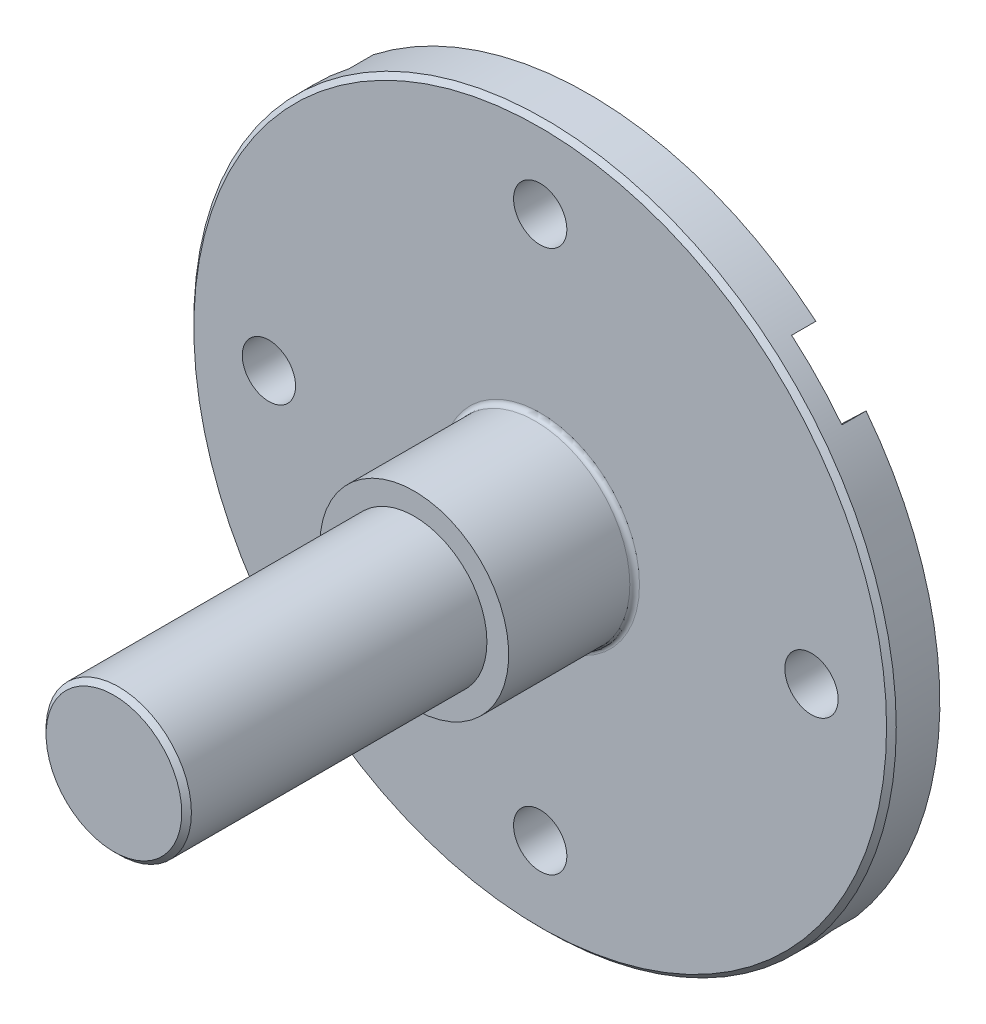
ISO-10303-21;
HEADER;
FILE_DESCRIPTION(('STEP AP214'),'2;1');
FILE_NAME('part.step','',(''),(''),'','','');
FILE_SCHEMA(('AUTOMOTIVE_DESIGN { 1 0 10303 214 1 1 1 1 }'));
ENDSEC;
DATA;
#1=APPLICATION_CONTEXT('core data for automotive mechanical design processes');
#2=APPLICATION_PROTOCOL_DEFINITION('international standard','automotive_design',2000,#1);
#3=PRODUCT_CONTEXT('',#1,'mechanical');
#4=PRODUCT('Part','Part','',(#3));
#5=PRODUCT_RELATED_PRODUCT_CATEGORY('part','',(#4));
#6=PRODUCT_DEFINITION_FORMATION('','',#4);
#7=PRODUCT_DEFINITION_CONTEXT('part definition',#1,'design');
#8=PRODUCT_DEFINITION('design','',#6,#7);
#9=PRODUCT_DEFINITION_SHAPE('','',#8);
#10=(LENGTH_UNIT() NAMED_UNIT(*) SI_UNIT(.MILLI.,.METRE.));
#11=(NAMED_UNIT(*) PLANE_ANGLE_UNIT() SI_UNIT($,.RADIAN.));
#12=(NAMED_UNIT(*) SI_UNIT($,.STERADIAN.) SOLID_ANGLE_UNIT());
#13=UNCERTAINTY_MEASURE_WITH_UNIT(LENGTH_MEASURE(1.E-05),#10,'distance_accuracy_value','');
#14=(GEOMETRIC_REPRESENTATION_CONTEXT(3) GLOBAL_UNCERTAINTY_ASSIGNED_CONTEXT((#13)) GLOBAL_UNIT_ASSIGNED_CONTEXT((#10,
#11,#12)) REPRESENTATION_CONTEXT('',''));
#15=CARTESIAN_POINT('',(0.,0.,0.));
#16=DIRECTION('',(0.,0.,1.));
#17=DIRECTION('',(1.,0.,0.));
#18=AXIS2_PLACEMENT_3D('',#15,#16,#17);
#19=CARTESIAN_POINT('',(0.,0.,10.));
#20=DIRECTION('',(0.,0.,1.));
#21=DIRECTION('',(1.,0.,0.));
#22=AXIS2_PLACEMENT_3D('',#19,#20,#21);
#23=PLANE('',#22);
#24=CARTESIAN_POINT('',(-0.00132234551098939,55.9999999843875,9.99999999999998));
#25=DIRECTION('',(0.,0.,1.));
#26=DIRECTION('',(1.,0.,0.));
#27=AXIS2_PLACEMENT_3D('',#24,#25,#26);
#28=CIRCLE('',#27,5.49999999999999);
#29=CARTESIAN_POINT('',(5.498677654489,55.9999999843875,9.99999999999998));
#30=VERTEX_POINT('',#29);
#31=EDGE_CURVE('E426',#30,#30,#28,.T.);
#32=ORIENTED_EDGE('',*,*,#31,.F.);
#33=EDGE_LOOP('',(#32));
#34=FACE_BOUND('',#33,.T.);
#35=CARTESIAN_POINT('',(-0.000731886751224875,-56.0000000140561,9.99999999999998));
#36=DIRECTION('',(0.,0.,1.));
#37=DIRECTION('',(1.,0.,0.));
#38=AXIS2_PLACEMENT_3D('',#35,#36,#37);
#39=CIRCLE('',#38,5.49999999999999);
#40=CARTESIAN_POINT('',(5.49926811324876,-56.0000000140561,9.99999999999998));
#41=VERTEX_POINT('',#40);
#42=EDGE_CURVE('E428',#41,#41,#39,.T.);
#43=ORIENTED_EDGE('',*,*,#42,.F.);
#44=EDGE_LOOP('',(#43));
#45=FACE_BOUND('',#44,.T.);
#46=CARTESIAN_POINT('',(-56.0010271153529,-0.000295244214201795,9.99999999999998));
#47=DIRECTION('',(0.,0.,1.));
#48=DIRECTION('',(1.,0.,0.));
#49=AXIS2_PLACEMENT_3D('',#46,#47,#48);
#50=CIRCLE('',#49,5.49999999999999);
#51=CARTESIAN_POINT('',(-50.5010271153529,-0.000295244214201795,9.99999999999998));
#52=VERTEX_POINT('',#51);
#53=EDGE_CURVE('E436',#52,#52,#50,.T.);
#54=ORIENTED_EDGE('',*,*,#53,.F.);
#55=EDGE_LOOP('',(#54));
#56=FACE_BOUND('',#55,.T.);
#57=CARTESIAN_POINT('',(55.9989728830907,0.000295214545569661,9.99999999999998));
#58=DIRECTION('',(0.,0.,1.));
#59=DIRECTION('',(1.,0.,0.));
#60=AXIS2_PLACEMENT_3D('',#57,#58,#59);
#61=CIRCLE('',#60,5.49999999999999);
#62=CARTESIAN_POINT('',(61.4989728830907,0.000295214545569661,9.99999999999998));
#63=VERTEX_POINT('',#62);
#64=EDGE_CURVE('E442',#63,#63,#61,.T.);
#65=ORIENTED_EDGE('',*,*,#64,.F.);
#66=EDGE_LOOP('',(#65));
#67=FACE_BOUND('',#66,.T.);
#68=CARTESIAN_POINT('',(0.,0.,10.));
#69=DIRECTION('',(0.,0.,1.));
#70=DIRECTION('',(1.,0.,0.));
#71=AXIS2_PLACEMENT_3D('',#68,#69,#70);
#72=CIRCLE('',#71,20.5);
#73=CARTESIAN_POINT('',(20.5,0.,10.));
#74=VERTEX_POINT('',#73);
#75=EDGE_CURVE('E285',#74,#74,#72,.F.);
#76=ORIENTED_EDGE('',*,*,#75,.T.);
#77=EDGE_LOOP('',(#76));
#78=FACE_BOUND('',#77,.T.);
#79=CARTESIAN_POINT('',(0.,0.,10.));
#80=DIRECTION('',(0.,0.,1.));
#81=DIRECTION('',(1.,0.,0.));
#82=AXIS2_PLACEMENT_3D('',#79,#80,#81);
#83=CIRCLE('',#82,71.5);
#84=CARTESIAN_POINT('',(71.5,0.,10.));
#85=VERTEX_POINT('',#84);
#86=EDGE_CURVE('E276',#85,#85,#83,.T.);
#87=ORIENTED_EDGE('',*,*,#86,.T.);
#88=EDGE_LOOP('',(#87));
#89=FACE_BOUND('',#88,.T.);
#90=ADVANCED_FACE('F37',(#34,#45,#56,#67,#78,#89),#23,.T.);
#91=CARTESIAN_POINT('',(0.,0.,10.));
#92=DIRECTION('',(0.,0.,-1.));
#93=DIRECTION('',(-1.,0.,0.));
#94=AXIS2_PLACEMENT_3D('',#91,#92,#93);
#95=CYLINDRICAL_SURFACE('',#94,72.5);
#96=CARTESIAN_POINT('',(0.,0.,9.00000000000003));
#97=DIRECTION('',(0.,0.,1.));
#98=DIRECTION('',(1.,0.,0.));
#99=AXIS2_PLACEMENT_3D('',#96,#97,#98);
#100=CIRCLE('',#99,72.5);
#101=CARTESIAN_POINT('',(72.5,0.,9.00000000000003));
#102=VERTEX_POINT('',#101);
#103=EDGE_CURVE('E279',#102,#102,#100,.F.);
#104=ORIENTED_EDGE('',*,*,#103,.T.);
#105=EDGE_LOOP('',(#104));
#106=FACE_BOUND('',#105,.T.);
#107=CARTESIAN_POINT('',(0.,0.,5.));
#108=DIRECTION('',(0.,0.,-1.));
#109=DIRECTION('',(0.,-1.,0.));
#110=AXIS2_PLACEMENT_3D('',#107,#108,#109);
#111=CIRCLE('',#110,72.5);
#112=CARTESIAN_POINT('',(-55.2891889648152,46.8972875933455,5.));
#113=VERTEX_POINT('',#112);
#114=CARTESIAN_POINT('',(-44.4549998969545,57.2713103059618,5.));
#115=VERTEX_POINT('',#114);
#116=EDGE_CURVE('E159',#113,#115,#111,.T.);
#117=ORIENTED_EDGE('',*,*,#116,.F.);
#118=DIRECTION('',(0.,0.,-1.));
#119=VECTOR('',#118,1.);
#120=CARTESIAN_POINT('',(-55.2891889648152,46.8972875933455,5.));
#121=LINE('',#120,#119);
#122=CARTESIAN_POINT('',(-55.2891889648152,46.8972875933455,0.));
#123=VERTEX_POINT('',#122);
#124=EDGE_CURVE('E197',#113,#123,#121,.T.);
#125=ORIENTED_EDGE('',*,*,#124,.T.);
#126=CARTESIAN_POINT('',(0.,0.,0.));
#127=DIRECTION('',(0.,0.,1.));
#128=DIRECTION('',(1.,0.,0.));
#129=AXIS2_PLACEMENT_3D('',#126,#127,#128);
#130=CIRCLE('',#129,72.5);
#131=CARTESIAN_POINT('',(-57.2713103059617,-44.4549998969547,0.));
#132=VERTEX_POINT('',#131);
#133=EDGE_CURVE('E60',#123,#132,#130,.T.);
#134=ORIENTED_EDGE('',*,*,#133,.T.);
#135=DIRECTION('',(0.,0.,-1.));
#136=VECTOR('',#135,1.);
#137=CARTESIAN_POINT('',(-57.2713103059617,-44.4549998969547,5.));
#138=LINE('',#137,#136);
#139=CARTESIAN_POINT('',(-57.2713103059617,-44.4549998969547,5.));
#140=VERTEX_POINT('',#139);
#141=EDGE_CURVE('E192',#140,#132,#138,.T.);
#142=ORIENTED_EDGE('',*,*,#141,.F.);
#143=CARTESIAN_POINT('',(0.,0.,5.));
#144=DIRECTION('',(0.,0.,-1.));
#145=DIRECTION('',(1.,0.,0.));
#146=AXIS2_PLACEMENT_3D('',#143,#144,#145);
#147=CIRCLE('',#146,72.5);
#148=CARTESIAN_POINT('',(-46.8972875933453,-55.2891889648154,5.));
#149=VERTEX_POINT('',#148);
#150=EDGE_CURVE('E179',#149,#140,#147,.T.);
#151=ORIENTED_EDGE('',*,*,#150,.F.);
#152=DIRECTION('',(0.,0.,-1.));
#153=VECTOR('',#152,1.);
#154=CARTESIAN_POINT('',(-46.8972875933453,-55.2891889648154,5.));
#155=LINE('',#154,#153);
#156=CARTESIAN_POINT('',(-46.8972875933453,-55.2891889648154,0.));
#157=VERTEX_POINT('',#156);
#158=EDGE_CURVE('E201',#149,#157,#155,.T.);
#159=ORIENTED_EDGE('',*,*,#158,.T.);
#160=CARTESIAN_POINT('',(44.4549998969549,-57.2713103059615,0.));
#161=VERTEX_POINT('',#160);
#162=EDGE_CURVE('E460',#157,#161,#130,.T.);
#163=ORIENTED_EDGE('',*,*,#162,.T.);
#164=DIRECTION('',(0.,0.,-1.));
#165=VECTOR('',#164,1.);
#166=CARTESIAN_POINT('',(44.4549998969549,-57.2713103059615,5.));
#167=LINE('',#166,#165);
#168=CARTESIAN_POINT('',(44.4549998969549,-57.2713103059615,5.));
#169=VERTEX_POINT('',#168);
#170=EDGE_CURVE('E223',#169,#161,#167,.T.);
#171=ORIENTED_EDGE('',*,*,#170,.F.);
#172=CARTESIAN_POINT('',(0.,0.,5.));
#173=DIRECTION('',(0.,0.,-1.));
#174=DIRECTION('',(0.,1.,0.));
#175=AXIS2_PLACEMENT_3D('',#172,#173,#174);
#176=CIRCLE('',#175,72.5);
#177=CARTESIAN_POINT('',(55.2891889648155,-46.8972875933451,5.));
#178=VERTEX_POINT('',#177);
#179=EDGE_CURVE('E210',#178,#169,#176,.T.);
#180=ORIENTED_EDGE('',*,*,#179,.F.);
#181=DIRECTION('',(0.,0.,-1.));
#182=VECTOR('',#181,1.);
#183=CARTESIAN_POINT('',(55.2891889648155,-46.8972875933451,5.));
#184=LINE('',#183,#182);
#185=CARTESIAN_POINT('',(55.2891889648155,-46.8972875933451,0.));
#186=VERTEX_POINT('',#185);
#187=EDGE_CURVE('E230',#178,#186,#184,.T.);
#188=ORIENTED_EDGE('',*,*,#187,.T.);
#189=CARTESIAN_POINT('',(57.2713103059614,44.4549998969551,0.));
#190=VERTEX_POINT('',#189);
#191=EDGE_CURVE('E271',#186,#190,#130,.T.);
#192=ORIENTED_EDGE('',*,*,#191,.T.);
#193=DIRECTION('',(0.,0.,-1.));
#194=VECTOR('',#193,1.);
#195=CARTESIAN_POINT('',(57.2713103059614,44.4549998969551,5.));
#196=LINE('',#195,#194);
#197=CARTESIAN_POINT('',(57.2713103059614,44.4549998969551,5.));
#198=VERTEX_POINT('',#197);
#199=EDGE_CURVE('E253',#198,#190,#196,.T.);
#200=ORIENTED_EDGE('',*,*,#199,.F.);
#201=CARTESIAN_POINT('',(0.,0.,5.));
#202=DIRECTION('',(0.,0.,-1.));
#203=DIRECTION('',(-1.,0.,0.));
#204=AXIS2_PLACEMENT_3D('',#201,#202,#203);
#205=CIRCLE('',#204,72.5);
#206=CARTESIAN_POINT('',(46.8972875933449,55.2891889648157,5.));
#207=VERTEX_POINT('',#206);
#208=EDGE_CURVE('E240',#207,#198,#205,.T.);
#209=ORIENTED_EDGE('',*,*,#208,.F.);
#210=DIRECTION('',(0.,0.,-1.));
#211=VECTOR('',#210,1.);
#212=CARTESIAN_POINT('',(46.8972875933449,55.2891889648157,5.));
#213=LINE('',#212,#211);
#214=CARTESIAN_POINT('',(46.8972875933449,55.2891889648157,0.));
#215=VERTEX_POINT('',#214);
#216=EDGE_CURVE('E260',#207,#215,#213,.T.);
#217=ORIENTED_EDGE('',*,*,#216,.T.);
#218=CARTESIAN_POINT('',(-44.4549998969545,57.2713103059619,0.));
#219=VERTEX_POINT('',#218);
#220=EDGE_CURVE('E172',#215,#219,#130,.T.);
#221=ORIENTED_EDGE('',*,*,#220,.T.);
#222=DIRECTION('',(0.,0.,-1.));
#223=VECTOR('',#222,1.);
#224=CARTESIAN_POINT('',(-44.4549998969545,57.2713103059618,5.));
#225=LINE('',#224,#223);
#226=EDGE_CURVE('E52',#115,#219,#225,.T.);
#227=ORIENTED_EDGE('',*,*,#226,.F.);
#228=EDGE_LOOP('',(#117,#125,#134,#142,#151,#159,#163,#171,#180,#188,#192,#200,#209,#217,#221,#227));
#229=FACE_BOUND('',#228,.T.);
#230=ADVANCED_FACE('F169',(#106,#229),#95,.T.);
#231=CARTESIAN_POINT('',(0.,0.,0.));
#232=DIRECTION('',(0.,0.,1.));
#233=DIRECTION('',(1.,0.,0.));
#234=AXIS2_PLACEMENT_3D('',#231,#232,#233);
#235=PLANE('',#234);
#236=CARTESIAN_POINT('',(-0.00132234551098939,55.9999999843875,0.));
#237=DIRECTION('',(0.,0.,1.));
#238=DIRECTION('',(1.,0.,0.));
#239=AXIS2_PLACEMENT_3D('',#236,#237,#238);
#240=CIRCLE('',#239,5.49999999999999);
#241=CARTESIAN_POINT('',(5.498677654489,55.9999999843875,0.));
#242=VERTEX_POINT('',#241);
#243=EDGE_CURVE('E424',#242,#242,#240,.T.);
#244=ORIENTED_EDGE('',*,*,#243,.T.);
#245=EDGE_LOOP('',(#244));
#246=FACE_BOUND('',#245,.T.);
#247=CARTESIAN_POINT('',(-0.000731886751224875,-56.0000000140561,0.));
#248=DIRECTION('',(0.,0.,1.));
#249=DIRECTION('',(1.,0.,0.));
#250=AXIS2_PLACEMENT_3D('',#247,#248,#249);
#251=CIRCLE('',#250,5.49999999999999);
#252=CARTESIAN_POINT('',(5.49926811324876,-56.0000000140561,0.));
#253=VERTEX_POINT('',#252);
#254=EDGE_CURVE('E433',#253,#253,#251,.T.);
#255=ORIENTED_EDGE('',*,*,#254,.T.);
#256=EDGE_LOOP('',(#255));
#257=FACE_BOUND('',#256,.T.);
#258=CARTESIAN_POINT('',(-56.0010271153529,-0.000295244214201795,0.));
#259=DIRECTION('',(0.,0.,1.));
#260=DIRECTION('',(1.,0.,0.));
#261=AXIS2_PLACEMENT_3D('',#258,#259,#260);
#262=CIRCLE('',#261,5.49999999999998);
#263=CARTESIAN_POINT('',(-50.5010271153529,-0.000295244214201795,0.));
#264=VERTEX_POINT('',#263);
#265=EDGE_CURVE('E439',#264,#264,#262,.T.);
#266=ORIENTED_EDGE('',*,*,#265,.T.);
#267=EDGE_LOOP('',(#266));
#268=FACE_BOUND('',#267,.T.);
#269=CARTESIAN_POINT('',(55.9989728830907,0.000295214545569661,0.));
#270=DIRECTION('',(0.,0.,1.));
#271=DIRECTION('',(1.,0.,0.));
#272=AXIS2_PLACEMENT_3D('',#269,#270,#271);
#273=CIRCLE('',#272,5.49999999999998);
#274=CARTESIAN_POINT('',(61.4989728830907,0.000295214545569661,0.));
#275=VERTEX_POINT('',#274);
#276=EDGE_CURVE('E445',#275,#275,#273,.T.);
#277=ORIENTED_EDGE('',*,*,#276,.T.);
#278=EDGE_LOOP('',(#277));
#279=FACE_BOUND('',#278,.T.);
#280=ORIENTED_EDGE('',*,*,#133,.F.);
#281=DIRECTION('',(-0.691601514174375,0.72227927119066,0.));
#282=VECTOR('',#281,1.);
#283=CARTESIAN_POINT('',(-22.7071323882898,12.8699704234584,0.));
#284=LINE('',#283,#282);
#285=CARTESIAN_POINT('',(-22.7071323882898,12.8699704234584,0.));
#286=VERTEX_POINT('',#285);
#287=EDGE_CURVE('E166',#286,#123,#284,.T.);
#288=ORIENTED_EDGE('',*,*,#287,.F.);
#289=CARTESIAN_POINT('',(-17.2900378543595,18.0569817797666,0.));
#290=DIRECTION('',(0.,0.,-1.));
#291=DIRECTION('',(0.,-1.,0.));
#292=AXIS2_PLACEMENT_3D('',#289,#290,#291);
#293=CIRCLE('',#292,7.50000000000053);
#294=CARTESIAN_POINT('',(-11.8729433204292,23.2439931360748,0.));
#295=VERTEX_POINT('',#294);
#296=EDGE_CURVE('E451',#295,#286,#293,.T.);
#297=ORIENTED_EDGE('',*,*,#296,.F.);
#298=DIRECTION('',(0.691601514174376,-0.72227927119066,0.));
#299=VECTOR('',#298,1.);
#300=CARTESIAN_POINT('',(-44.4549998969545,57.2713103059618,0.));
#301=LINE('',#300,#299);
#302=EDGE_CURVE('E447',#219,#295,#301,.T.);
#303=ORIENTED_EDGE('',*,*,#302,.F.);
#304=ORIENTED_EDGE('',*,*,#220,.F.);
#305=DIRECTION('',(0.722279271190653,0.691601514174383,0.));
#306=VECTOR('',#305,1.);
#307=CARTESIAN_POINT('',(12.8699704234582,22.70713238829,0.));
#308=LINE('',#307,#306);
#309=CARTESIAN_POINT('',(12.8699704234582,22.7071323882899,0.));
#310=VERTEX_POINT('',#309);
#311=EDGE_CURVE('E244',#310,#215,#308,.T.);
#312=ORIENTED_EDGE('',*,*,#311,.F.);
#313=CARTESIAN_POINT('',(18.0569817797664,17.2900378543597,0.));
#314=DIRECTION('',(0.,0.,-1.));
#315=DIRECTION('',(-1.,0.,0.));
#316=AXIS2_PLACEMENT_3D('',#313,#314,#315);
#317=CIRCLE('',#316,7.50000000000053);
#318=CARTESIAN_POINT('',(23.2439931360747,11.8729433204294,0.));
#319=VERTEX_POINT('',#318);
#320=EDGE_CURVE('E256',#319,#310,#317,.T.);
#321=ORIENTED_EDGE('',*,*,#320,.F.);
#322=DIRECTION('',(-0.722279271190653,-0.691601514174383,0.));
#323=VECTOR('',#322,1.);
#324=CARTESIAN_POINT('',(57.2713103059614,44.4549998969551,0.));
#325=LINE('',#324,#323);
#326=EDGE_CURVE('E233',#190,#319,#325,.T.);
#327=ORIENTED_EDGE('',*,*,#326,.F.);
#328=ORIENTED_EDGE('',*,*,#191,.F.);
#329=DIRECTION('',(0.69160151417438,-0.722279271190655,0.));
#330=VECTOR('',#329,1.);
#331=CARTESIAN_POINT('',(22.7071323882899,-12.8699704234583,0.));
#332=LINE('',#331,#330);
#333=CARTESIAN_POINT('',(22.7071323882899,-12.8699704234583,0.));
#334=VERTEX_POINT('',#333);
#335=EDGE_CURVE('E214',#334,#186,#332,.T.);
#336=ORIENTED_EDGE('',*,*,#335,.F.);
#337=CARTESIAN_POINT('',(17.2900378543596,-18.0569817797665,0.));
#338=DIRECTION('',(0.,0.,-1.));
#339=DIRECTION('',(0.,1.,0.));
#340=AXIS2_PLACEMENT_3D('',#337,#338,#339);
#341=CIRCLE('',#340,7.50000000000053);
#342=CARTESIAN_POINT('',(11.8729433204293,-23.2439931360747,0.));
#343=VERTEX_POINT('',#342);
#344=EDGE_CURVE('E226',#343,#334,#341,.T.);
#345=ORIENTED_EDGE('',*,*,#344,.F.);
#346=DIRECTION('',(-0.691601514174381,0.722279271190655,0.));
#347=VECTOR('',#346,1.);
#348=CARTESIAN_POINT('',(44.4549998969549,-57.2713103059615,0.));
#349=LINE('',#348,#347);
#350=EDGE_CURVE('E204',#161,#343,#349,.T.);
#351=ORIENTED_EDGE('',*,*,#350,.F.);
#352=ORIENTED_EDGE('',*,*,#162,.F.);
#353=DIRECTION('',(-0.722279271190658,-0.691601514174378,0.));
#354=VECTOR('',#353,1.);
#355=CARTESIAN_POINT('',(-12.8699704234584,-22.7071323882899,0.));
#356=LINE('',#355,#354);
#357=CARTESIAN_POINT('',(-12.8699704234584,-22.7071323882899,0.));
#358=VERTEX_POINT('',#357);
#359=EDGE_CURVE('E183',#358,#157,#356,.T.);
#360=ORIENTED_EDGE('',*,*,#359,.F.);
#361=CARTESIAN_POINT('',(-18.0569817797666,-17.2900378543595,0.));
#362=DIRECTION('',(0.,0.,-1.));
#363=DIRECTION('',(1.,0.,0.));
#364=AXIS2_PLACEMENT_3D('',#361,#362,#363);
#365=CIRCLE('',#364,7.50000000000053);
#366=CARTESIAN_POINT('',(-23.2439931360748,-11.8729433204292,0.));
#367=VERTEX_POINT('',#366);
#368=EDGE_CURVE('E196',#367,#358,#365,.T.);
#369=ORIENTED_EDGE('',*,*,#368,.F.);
#370=DIRECTION('',(0.722279271190657,0.691601514174378,0.));
#371=VECTOR('',#370,1.);
#372=CARTESIAN_POINT('',(-57.2713103059617,-44.4549998969547,0.));
#373=LINE('',#372,#371);
#374=EDGE_CURVE('E193',#132,#367,#373,.T.);
#375=ORIENTED_EDGE('',*,*,#374,.F.);
#376=EDGE_LOOP('',(#280,#288,#297,#303,#304,#312,#321,#327,#328,#336,#345,#351,#352,#360,#369,#375));
#377=FACE_BOUND('',#376,.T.);
#378=ADVANCED_FACE('F310',(#246,#257,#268,#279,#377),#235,.F.);
#379=CARTESIAN_POINT('',(0.,0.,36.));
#380=DIRECTION('',(0.,0.,-1.));
#381=DIRECTION('',(-1.,0.,0.));
#382=AXIS2_PLACEMENT_3D('',#379,#380,#381);
#383=CYLINDRICAL_SURFACE('',#382,19.5);
#384=CARTESIAN_POINT('',(0.,0.,11.));
#385=DIRECTION('',(0.,0.,1.));
#386=DIRECTION('',(1.,0.,0.));
#387=AXIS2_PLACEMENT_3D('',#384,#385,#386);
#388=CIRCLE('',#387,19.5);
#389=CARTESIAN_POINT('',(-19.5,0.,11.));
#390=VERTEX_POINT('',#389);
#391=EDGE_CURVE('E282',#390,#390,#388,.T.);
#392=CARTESIAN_POINT('',(0.,0.,36.));
#393=DIRECTION('',(0.,0.,1.));
#394=DIRECTION('',(1.,0.,0.));
#395=AXIS2_PLACEMENT_3D('',#392,#393,#394);
#396=CIRCLE('',#395,19.5);
#397=CARTESIAN_POINT('',(-19.5,0.,36.));
#398=VERTEX_POINT('',#397);
#399=EDGE_CURVE('E262',#398,#398,#396,.T.);
#400=CARTESIAN_POINT('',(-19.5,0.,11.));
#401=CARTESIAN_POINT('',(-19.5,0.,11.2604166666667));
#402=CARTESIAN_POINT('',(-19.5,0.,11.5208333333333));
#403=CARTESIAN_POINT('',(-19.5,0.,12.0416666666667));
#404=CARTESIAN_POINT('',(-19.5,0.,12.3020833333333));
#405=CARTESIAN_POINT('',(-19.5,0.,12.8229166666667));
#406=CARTESIAN_POINT('',(-19.5,0.,13.0833333333333));
#407=CARTESIAN_POINT('',(-19.5,0.,13.6041666666667));
#408=CARTESIAN_POINT('',(-19.5,0.,13.8645833333333));
#409=CARTESIAN_POINT('',(-19.5,0.,14.3854166666667));
#410=CARTESIAN_POINT('',(-19.5,0.,14.6458333333333));
#411=CARTESIAN_POINT('',(-19.5,0.,15.1666666666667));
#412=CARTESIAN_POINT('',(-19.5,0.,15.4270833333333));
#413=CARTESIAN_POINT('',(-19.5,0.,15.9479166666667));
#414=CARTESIAN_POINT('',(-19.5,0.,16.2083333333333));
#415=CARTESIAN_POINT('',(-19.5,0.,16.7291666666667));
#416=CARTESIAN_POINT('',(-19.5,0.,16.9895833333333));
#417=CARTESIAN_POINT('',(-19.5,0.,17.5104166666667));
#418=CARTESIAN_POINT('',(-19.5,0.,17.7708333333333));
#419=CARTESIAN_POINT('',(-19.5,0.,18.2916666666667));
#420=CARTESIAN_POINT('',(-19.5,0.,18.5520833333333));
#421=CARTESIAN_POINT('',(-19.5,0.,19.0729166666667));
#422=CARTESIAN_POINT('',(-19.5,0.,19.3333333333333));
#423=CARTESIAN_POINT('',(-19.5,0.,19.8541666666667));
#424=CARTESIAN_POINT('',(-19.5,0.,20.1145833333333));
#425=CARTESIAN_POINT('',(-19.5,0.,20.6354166666667));
#426=CARTESIAN_POINT('',(-19.5,0.,20.8958333333333));
#427=CARTESIAN_POINT('',(-19.5,0.,21.4166666666667));
#428=CARTESIAN_POINT('',(-19.5,0.,21.6770833333333));
#429=CARTESIAN_POINT('',(-19.5,0.,22.1979166666667));
#430=CARTESIAN_POINT('',(-19.5,0.,22.4583333333333));
#431=CARTESIAN_POINT('',(-19.5,0.,22.9791666666667));
#432=CARTESIAN_POINT('',(-19.5,0.,23.2395833333333));
#433=CARTESIAN_POINT('',(-19.5,0.,23.7604166666667));
#434=CARTESIAN_POINT('',(-19.5,0.,24.0208333333333));
#435=CARTESIAN_POINT('',(-19.5,0.,24.5416666666667));
#436=CARTESIAN_POINT('',(-19.5,0.,24.8020833333333));
#437=CARTESIAN_POINT('',(-19.5,0.,25.3229166666667));
#438=CARTESIAN_POINT('',(-19.5,0.,25.5833333333333));
#439=CARTESIAN_POINT('',(-19.5,0.,26.1041666666667));
#440=CARTESIAN_POINT('',(-19.5,0.,26.3645833333333));
#441=CARTESIAN_POINT('',(-19.5,0.,26.8854166666667));
#442=CARTESIAN_POINT('',(-19.5,0.,27.1458333333333));
#443=CARTESIAN_POINT('',(-19.5,0.,27.6666666666667));
#444=CARTESIAN_POINT('',(-19.5,0.,27.9270833333333));
#445=CARTESIAN_POINT('',(-19.5,0.,28.4479166666667));
#446=CARTESIAN_POINT('',(-19.5,0.,28.7083333333333));
#447=CARTESIAN_POINT('',(-19.5,0.,29.2291666666667));
#448=CARTESIAN_POINT('',(-19.5,0.,29.4895833333333));
#449=CARTESIAN_POINT('',(-19.5,0.,30.0104166666667));
#450=CARTESIAN_POINT('',(-19.5,0.,30.2708333333333));
#451=CARTESIAN_POINT('',(-19.5,0.,30.7916666666667));
#452=CARTESIAN_POINT('',(-19.5,0.,31.0520833333333));
#453=CARTESIAN_POINT('',(-19.5,0.,31.5729166666667));
#454=CARTESIAN_POINT('',(-19.5,0.,31.8333333333333));
#455=CARTESIAN_POINT('',(-19.5,0.,32.3541666666667));
#456=CARTESIAN_POINT('',(-19.5,0.,32.6145833333333));
#457=CARTESIAN_POINT('',(-19.5,0.,33.1354166666667));
#458=CARTESIAN_POINT('',(-19.5,0.,33.3958333333333));
#459=CARTESIAN_POINT('',(-19.5,0.,33.9166666666667));
#460=CARTESIAN_POINT('',(-19.5,0.,34.1770833333333));
#461=CARTESIAN_POINT('',(-19.5,0.,34.6979166666667));
#462=CARTESIAN_POINT('',(-19.5,0.,34.9583333333333));
#463=CARTESIAN_POINT('',(-19.5,0.,35.4791666666667));
#464=CARTESIAN_POINT('',(-19.5,0.,35.7395833333333));
#465=CARTESIAN_POINT('',(-19.5,0.,36.));
#466=B_SPLINE_CURVE_WITH_KNOTS('',3,(#400,#401,#402,#403,#404,#405,#406,#407,#408,#409,#410,
#411,#412,#413,#414,#415,#416,#417,#418,#419,#420,#421,#422,#423,#424,#425,#426,#427,#428,#429,
#430,#431,#432,#433,#434,#435,#436,#437,#438,#439,#440,#441,#442,#443,#444,#445,#446,#447,#448,
#449,#450,#451,#452,#453,#454,#455,#456,#457,#458,#459,#460,#461,#462,#463,#464,#465),
.UNSPECIFIED.,.F.,.F.,(4,2,2,2,2,2,2,2,2,2,2,2,2,2,2,2,2,2,2,2,2,2,2,2,2,2,2,2,2,2,2,2,4),(0.,
0.781250000000001,1.5625,2.34375,3.125,3.90625,4.6875,5.46875,6.25,7.03125,7.8125,8.59375,9.375,
10.15625,10.9375,11.71875,12.5,13.28125,14.0625,14.84375,15.625,16.40625,17.1875,17.96875,18.75,
19.53125,20.3125,21.09375,21.875,22.65625,23.4375,24.21875,25.),.UNSPECIFIED.);
#467=EDGE_CURVE('BSEAM317',#390,#398,#466,.T.);
#468=ORIENTED_EDGE('',*,*,#391,.T.);
#469=ORIENTED_EDGE('',*,*,#399,.F.);
#470=ORIENTED_EDGE('',*,*,#467,.T.);
#471=ORIENTED_EDGE('',*,*,#467,.F.);
#472=EDGE_LOOP('',(#468,#470,#469,#471));
#473=FACE_BOUND('',#472,.T.);
#474=ADVANCED_FACE('F317',(#473),#383,.T.);
#475=CARTESIAN_POINT('',(0.,0.,36.));
#476=DIRECTION('',(0.,0.,1.));
#477=DIRECTION('',(1.,0.,0.));
#478=AXIS2_PLACEMENT_3D('',#475,#476,#477);
#479=PLANE('',#478);
#480=CARTESIAN_POINT('',(0.,0.,36.));
#481=DIRECTION('',(0.,0.,1.));
#482=DIRECTION('',(1.,0.,0.));
#483=AXIS2_PLACEMENT_3D('',#480,#481,#482);
#484=CIRCLE('',#483,15.);
#485=CARTESIAN_POINT('',(15.,0.,36.));
#486=VERTEX_POINT('',#485);
#487=EDGE_CURVE('E273',#486,#486,#484,.T.);
#488=ORIENTED_EDGE('',*,*,#487,.F.);
#489=EDGE_LOOP('',(#488));
#490=FACE_BOUND('',#489,.T.);
#491=ORIENTED_EDGE('',*,*,#399,.T.);
#492=EDGE_LOOP('',(#491));
#493=FACE_BOUND('',#492,.T.);
#494=ADVANCED_FACE('F341',(#490,#493),#479,.T.);
#495=CARTESIAN_POINT('',(0.,0.,31.));
#496=DIRECTION('',(0.,0.,1.));
#497=DIRECTION('',(1.,0.,0.));
#498=AXIS2_PLACEMENT_3D('',#495,#496,#497);
#499=CYLINDRICAL_SURFACE('',#498,15.);
#500=CARTESIAN_POINT('',(0.,0.,97.));
#501=DIRECTION('',(0.,0.,1.));
#502=DIRECTION('',(1.,0.,0.));
#503=AXIS2_PLACEMENT_3D('',#500,#501,#502);
#504=CIRCLE('',#503,15.);
#505=CARTESIAN_POINT('',(15.,0.,97.));
#506=VERTEX_POINT('',#505);
#507=EDGE_CURVE('E11',#506,#506,#504,.F.);
#508=ORIENTED_EDGE('',*,*,#507,.T.);
#509=EDGE_LOOP('',(#508));
#510=FACE_BOUND('',#509,.T.);
#511=ORIENTED_EDGE('',*,*,#487,.T.);
#512=EDGE_LOOP('',(#511));
#513=FACE_BOUND('',#512,.T.);
#514=ADVANCED_FACE('F345',(#510,#513),#499,.T.);
#515=CARTESIAN_POINT('',(0.,0.,98.));
#516=DIRECTION('',(0.,0.,1.));
#517=DIRECTION('',(1.,0.,0.));
#518=AXIS2_PLACEMENT_3D('',#515,#516,#517);
#519=PLANE('',#518);
#520=CARTESIAN_POINT('',(0.,0.,98.));
#521=DIRECTION('',(0.,0.,1.));
#522=DIRECTION('',(1.,0.,0.));
#523=AXIS2_PLACEMENT_3D('',#520,#521,#522);
#524=CIRCLE('',#523,14.);
#525=CARTESIAN_POINT('',(14.,0.,98.));
#526=VERTEX_POINT('',#525);
#527=EDGE_CURVE('E45',#526,#526,#524,.T.);
#528=ORIENTED_EDGE('',*,*,#527,.T.);
#529=EDGE_LOOP('',(#528));
#530=FACE_BOUND('',#529,.T.);
#531=ADVANCED_FACE('F290',(#530),#519,.T.);
#532=CARTESIAN_POINT('',(0.,0.,10.));
#533=DIRECTION('',(0.,0.,-1.));
#534=DIRECTION('',(-1.,0.,0.));
#535=AXIS2_PLACEMENT_3D('',#532,#533,#534);
#536=CONICAL_SURFACE('',#535,71.5,0.785398163397455);
#537=ORIENTED_EDGE('',*,*,#103,.F.);
#538=EDGE_LOOP('',(#537));
#539=FACE_BOUND('',#538,.T.);
#540=ORIENTED_EDGE('',*,*,#86,.F.);
#541=EDGE_LOOP('',(#540));
#542=FACE_BOUND('',#541,.T.);
#543=ADVANCED_FACE('F322',(#539,#542),#536,.T.);
#544=CARTESIAN_POINT('',(0.,0.,11.));
#545=DIRECTION('',(0.,0.,1.));
#546=DIRECTION('',(1.,0.,0.));
#547=AXIS2_PLACEMENT_3D('',#544,#545,#546);
#548=TOROIDAL_SURFACE('',#547,20.5,1.);
#549=ORIENTED_EDGE('',*,*,#75,.F.);
#550=EDGE_LOOP('',(#549));
#551=FACE_BOUND('',#550,.T.);
#552=ORIENTED_EDGE('',*,*,#391,.F.);
#553=EDGE_LOOP('',(#552));
#554=FACE_BOUND('',#553,.T.);
#555=ADVANCED_FACE('F324',(#551,#554),#548,.F.);
#556=CARTESIAN_POINT('',(12.8699704234582,22.70713238829,5.));
#557=DIRECTION('',(-0.691601514174383,0.722279271190653,0.));
#558=DIRECTION('',(-0.722279271190653,-0.691601514174383,0.));
#559=AXIS2_PLACEMENT_3D('',#556,#557,#558);
#560=PLANE('',#559);
#561=ORIENTED_EDGE('',*,*,#311,.T.);
#562=ORIENTED_EDGE('',*,*,#216,.F.);
#563=DIRECTION('',(0.722279271190653,0.691601514174383,0.));
#564=VECTOR('',#563,1.);
#565=CARTESIAN_POINT('',(12.8699704234582,22.70713238829,5.));
#566=LINE('',#565,#564);
#567=CARTESIAN_POINT('',(12.8699704234582,22.7071323882899,5.));
#568=VERTEX_POINT('',#567);
#569=EDGE_CURVE('E250',#568,#207,#566,.T.);
#570=ORIENTED_EDGE('',*,*,#569,.F.);
#571=DIRECTION('',(0.,0.,-1.));
#572=VECTOR('',#571,1.);
#573=CARTESIAN_POINT('',(12.8699704234582,22.7071323882899,5.));
#574=LINE('',#573,#572);
#575=EDGE_CURVE('E263',#568,#310,#574,.T.);
#576=ORIENTED_EDGE('',*,*,#575,.T.);
#577=EDGE_LOOP('',(#561,#562,#570,#576));
#578=FACE_BOUND('',#577,.T.);
#579=ADVANCED_FACE('F327',(#578),#560,.F.);
#580=CARTESIAN_POINT('',(18.0569817797664,17.2900378543597,5.));
#581=DIRECTION('',(0.,0.,-1.));
#582=DIRECTION('',(-1.,0.,0.));
#583=AXIS2_PLACEMENT_3D('',#580,#581,#582);
#584=CYLINDRICAL_SURFACE('',#583,7.50000000000053);
#585=ORIENTED_EDGE('',*,*,#320,.T.);
#586=ORIENTED_EDGE('',*,*,#575,.F.);
#587=CARTESIAN_POINT('',(18.0569817797664,17.2900378543597,5.));
#588=DIRECTION('',(0.,0.,-1.));
#589=DIRECTION('',(-1.,0.,0.));
#590=AXIS2_PLACEMENT_3D('',#587,#588,#589);
#591=CIRCLE('',#590,7.50000000000053);
#592=CARTESIAN_POINT('',(23.2439931360747,11.8729433204294,5.));
#593=VERTEX_POINT('',#592);
#594=EDGE_CURVE('E247',#593,#568,#591,.T.);
#595=ORIENTED_EDGE('',*,*,#594,.F.);
#596=DIRECTION('',(0.,0.,-1.));
#597=VECTOR('',#596,1.);
#598=CARTESIAN_POINT('',(23.2439931360747,11.8729433204294,5.));
#599=LINE('',#598,#597);
#600=EDGE_CURVE('E265',#593,#319,#599,.T.);
#601=ORIENTED_EDGE('',*,*,#600,.T.);
#602=EDGE_LOOP('',(#585,#586,#595,#601));
#603=FACE_BOUND('',#602,.T.);
#604=ADVANCED_FACE('F332',(#603),#584,.F.);
#605=CARTESIAN_POINT('',(57.2713103059614,44.4549998969551,5.));
#606=DIRECTION('',(0.691601514174383,-0.722279271190653,0.));
#607=DIRECTION('',(0.722279271190653,0.691601514174383,0.));
#608=AXIS2_PLACEMENT_3D('',#605,#606,#607);
#609=PLANE('',#608);
#610=ORIENTED_EDGE('',*,*,#326,.T.);
#611=ORIENTED_EDGE('',*,*,#600,.F.);
#612=DIRECTION('',(-0.722279271190653,-0.691601514174383,0.));
#613=VECTOR('',#612,1.);
#614=CARTESIAN_POINT('',(57.2713103059614,44.4549998969551,5.));
#615=LINE('',#614,#613);
#616=EDGE_CURVE('E243',#198,#593,#615,.T.);
#617=ORIENTED_EDGE('',*,*,#616,.F.);
#618=ORIENTED_EDGE('',*,*,#199,.T.);
#619=EDGE_LOOP('',(#610,#611,#617,#618));
#620=FACE_BOUND('',#619,.T.);
#621=ADVANCED_FACE('F356',(#620),#609,.F.);
#622=CARTESIAN_POINT('',(0.,0.,5.));
#623=DIRECTION('',(0.,0.,-1.));
#624=DIRECTION('',(-1.,0.,0.));
#625=AXIS2_PLACEMENT_3D('',#622,#623,#624);
#626=PLANE('',#625);
#627=ORIENTED_EDGE('',*,*,#208,.T.);
#628=ORIENTED_EDGE('',*,*,#616,.T.);
#629=ORIENTED_EDGE('',*,*,#594,.T.);
#630=ORIENTED_EDGE('',*,*,#569,.T.);
#631=EDGE_LOOP('',(#627,#628,#629,#630));
#632=FACE_BOUND('',#631,.T.);
#633=ADVANCED_FACE('F359',(#632),#626,.T.);
#634=CARTESIAN_POINT('',(22.7071323882899,-12.8699704234583,5.));
#635=DIRECTION('',(0.722279271190655,0.69160151417438,0.));
#636=DIRECTION('',(-0.69160151417438,0.722279271190655,0.));
#637=AXIS2_PLACEMENT_3D('',#634,#635,#636);
#638=PLANE('',#637);
#639=ORIENTED_EDGE('',*,*,#335,.T.);
#640=ORIENTED_EDGE('',*,*,#187,.F.);
#641=DIRECTION('',(0.69160151417438,-0.722279271190655,0.));
#642=VECTOR('',#641,1.);
#643=CARTESIAN_POINT('',(22.7071323882899,-12.8699704234583,5.));
#644=LINE('',#643,#642);
#645=CARTESIAN_POINT('',(22.7071323882899,-12.8699704234583,5.));
#646=VERTEX_POINT('',#645);
#647=EDGE_CURVE('E220',#646,#178,#644,.T.);
#648=ORIENTED_EDGE('',*,*,#647,.F.);
#649=DIRECTION('',(0.,0.,-1.));
#650=VECTOR('',#649,1.);
#651=CARTESIAN_POINT('',(22.7071323882899,-12.8699704234583,5.));
#652=LINE('',#651,#650);
#653=EDGE_CURVE('E234',#646,#334,#652,.T.);
#654=ORIENTED_EDGE('',*,*,#653,.T.);
#655=EDGE_LOOP('',(#639,#640,#648,#654));
#656=FACE_BOUND('',#655,.T.);
#657=ADVANCED_FACE('F366',(#656),#638,.F.);
#658=CARTESIAN_POINT('',(17.2900378543596,-18.0569817797665,5.));
#659=DIRECTION('',(0.,0.,-1.));
#660=DIRECTION('',(-1.,0.,0.));
#661=AXIS2_PLACEMENT_3D('',#658,#659,#660);
#662=CYLINDRICAL_SURFACE('',#661,7.50000000000053);
#663=ORIENTED_EDGE('',*,*,#344,.T.);
#664=ORIENTED_EDGE('',*,*,#653,.F.);
#665=CARTESIAN_POINT('',(17.2900378543596,-18.0569817797665,5.));
#666=DIRECTION('',(0.,0.,-1.));
#667=DIRECTION('',(0.,1.,0.));
#668=AXIS2_PLACEMENT_3D('',#665,#666,#667);
#669=CIRCLE('',#668,7.50000000000053);
#670=CARTESIAN_POINT('',(11.8729433204293,-23.2439931360747,5.));
#671=VERTEX_POINT('',#670);
#672=EDGE_CURVE('E217',#671,#646,#669,.T.);
#673=ORIENTED_EDGE('',*,*,#672,.F.);
#674=DIRECTION('',(0.,0.,-1.));
#675=VECTOR('',#674,1.);
#676=CARTESIAN_POINT('',(11.8729433204293,-23.2439931360747,5.));
#677=LINE('',#676,#675);
#678=EDGE_CURVE('E236',#671,#343,#677,.T.);
#679=ORIENTED_EDGE('',*,*,#678,.T.);
#680=EDGE_LOOP('',(#663,#664,#673,#679));
#681=FACE_BOUND('',#680,.T.);
#682=ADVANCED_FACE('F372',(#681),#662,.F.);
#683=CARTESIAN_POINT('',(44.4549998969549,-57.2713103059615,5.));
#684=DIRECTION('',(-0.722279271190655,-0.691601514174381,0.));
#685=DIRECTION('',(0.691601514174381,-0.722279271190655,0.));
#686=AXIS2_PLACEMENT_3D('',#683,#684,#685);
#687=PLANE('',#686);
#688=ORIENTED_EDGE('',*,*,#350,.T.);
#689=ORIENTED_EDGE('',*,*,#678,.F.);
#690=DIRECTION('',(-0.691601514174381,0.722279271190655,0.));
#691=VECTOR('',#690,1.);
#692=CARTESIAN_POINT('',(44.4549998969549,-57.2713103059615,5.));
#693=LINE('',#692,#691);
#694=EDGE_CURVE('E213',#169,#671,#693,.T.);
#695=ORIENTED_EDGE('',*,*,#694,.F.);
#696=ORIENTED_EDGE('',*,*,#170,.T.);
#697=EDGE_LOOP('',(#688,#689,#695,#696));
#698=FACE_BOUND('',#697,.T.);
#699=ADVANCED_FACE('F368',(#698),#687,.F.);
#700=CARTESIAN_POINT('',(0.,0.,5.));
#701=DIRECTION('',(0.,0.,-1.));
#702=DIRECTION('',(0.,1.,0.));
#703=AXIS2_PLACEMENT_3D('',#700,#701,#702);
#704=PLANE('',#703);
#705=ORIENTED_EDGE('',*,*,#179,.T.);
#706=ORIENTED_EDGE('',*,*,#694,.T.);
#707=ORIENTED_EDGE('',*,*,#672,.T.);
#708=ORIENTED_EDGE('',*,*,#647,.T.);
#709=EDGE_LOOP('',(#705,#706,#707,#708));
#710=FACE_BOUND('',#709,.T.);
#711=ADVANCED_FACE('F371',(#710),#704,.T.);
#712=CARTESIAN_POINT('',(-12.8699704234584,-22.7071323882899,5.));
#713=DIRECTION('',(0.691601514174378,-0.722279271190658,0.));
#714=DIRECTION('',(0.722279271190658,0.691601514174378,0.));
#715=AXIS2_PLACEMENT_3D('',#712,#713,#714);
#716=PLANE('',#715);
#717=ORIENTED_EDGE('',*,*,#359,.T.);
#718=ORIENTED_EDGE('',*,*,#158,.F.);
#719=DIRECTION('',(-0.722279271190658,-0.691601514174378,0.));
#720=VECTOR('',#719,1.);
#721=CARTESIAN_POINT('',(-12.8699704234584,-22.7071323882899,5.));
#722=LINE('',#721,#720);
#723=CARTESIAN_POINT('',(-12.8699704234584,-22.7071323882899,5.));
#724=VERTEX_POINT('',#723);
#725=EDGE_CURVE('E189',#724,#149,#722,.T.);
#726=ORIENTED_EDGE('',*,*,#725,.F.);
#727=DIRECTION('',(0.,0.,-1.));
#728=VECTOR('',#727,1.);
#729=CARTESIAN_POINT('',(-12.8699704234584,-22.7071323882899,5.));
#730=LINE('',#729,#728);
#731=EDGE_CURVE('E205',#724,#358,#730,.T.);
#732=ORIENTED_EDGE('',*,*,#731,.T.);
#733=EDGE_LOOP('',(#717,#718,#726,#732));
#734=FACE_BOUND('',#733,.T.);
#735=ADVANCED_FACE('F382',(#734),#716,.F.);
#736=CARTESIAN_POINT('',(-18.0569817797666,-17.2900378543595,5.));
#737=DIRECTION('',(0.,0.,-1.));
#738=DIRECTION('',(-1.,0.,0.));
#739=AXIS2_PLACEMENT_3D('',#736,#737,#738);
#740=CYLINDRICAL_SURFACE('',#739,7.50000000000053);
#741=ORIENTED_EDGE('',*,*,#368,.T.);
#742=ORIENTED_EDGE('',*,*,#731,.F.);
#743=CARTESIAN_POINT('',(-18.0569817797666,-17.2900378543595,5.));
#744=DIRECTION('',(0.,0.,-1.));
#745=DIRECTION('',(1.,0.,0.));
#746=AXIS2_PLACEMENT_3D('',#743,#744,#745);
#747=CIRCLE('',#746,7.50000000000053);
#748=CARTESIAN_POINT('',(-23.2439931360748,-11.8729433204292,5.));
#749=VERTEX_POINT('',#748);
#750=EDGE_CURVE('E186',#749,#724,#747,.T.);
#751=ORIENTED_EDGE('',*,*,#750,.F.);
#752=DIRECTION('',(0.,0.,-1.));
#753=VECTOR('',#752,1.);
#754=CARTESIAN_POINT('',(-23.2439931360748,-11.8729433204292,5.));
#755=LINE('',#754,#753);
#756=EDGE_CURVE('E207',#749,#367,#755,.T.);
#757=ORIENTED_EDGE('',*,*,#756,.T.);
#758=EDGE_LOOP('',(#741,#742,#751,#757));
#759=FACE_BOUND('',#758,.T.);
#760=ADVANCED_FACE('F388',(#759),#740,.F.);
#761=CARTESIAN_POINT('',(-57.2713103059617,-44.4549998969547,5.));
#762=DIRECTION('',(-0.691601514174378,0.722279271190657,0.));
#763=DIRECTION('',(-0.722279271190658,-0.691601514174378,0.));
#764=AXIS2_PLACEMENT_3D('',#761,#762,#763);
#765=PLANE('',#764);
#766=ORIENTED_EDGE('',*,*,#374,.T.);
#767=ORIENTED_EDGE('',*,*,#756,.F.);
#768=DIRECTION('',(0.722279271190657,0.691601514174378,0.));
#769=VECTOR('',#768,1.);
#770=CARTESIAN_POINT('',(-57.2713103059617,-44.4549998969547,5.));
#771=LINE('',#770,#769);
#772=EDGE_CURVE('E182',#140,#749,#771,.T.);
#773=ORIENTED_EDGE('',*,*,#772,.F.);
#774=ORIENTED_EDGE('',*,*,#141,.T.);
#775=EDGE_LOOP('',(#766,#767,#773,#774));
#776=FACE_BOUND('',#775,.T.);
#777=ADVANCED_FACE('F384',(#776),#765,.F.);
#778=CARTESIAN_POINT('',(0.,0.,5.));
#779=DIRECTION('',(0.,0.,-1.));
#780=DIRECTION('',(1.,0.,0.));
#781=AXIS2_PLACEMENT_3D('',#778,#779,#780);
#782=PLANE('',#781);
#783=ORIENTED_EDGE('',*,*,#150,.T.);
#784=ORIENTED_EDGE('',*,*,#772,.T.);
#785=ORIENTED_EDGE('',*,*,#750,.T.);
#786=ORIENTED_EDGE('',*,*,#725,.T.);
#787=EDGE_LOOP('',(#783,#784,#785,#786));
#788=FACE_BOUND('',#787,.T.);
#789=ADVANCED_FACE('F387',(#788),#782,.T.);
#790=CARTESIAN_POINT('',(-22.7071323882898,12.8699704234584,5.));
#791=DIRECTION('',(-0.72227927119066,-0.691601514174375,0.));
#792=DIRECTION('',(0.691601514174375,-0.72227927119066,0.));
#793=AXIS2_PLACEMENT_3D('',#790,#791,#792);
#794=PLANE('',#793);
#795=ORIENTED_EDGE('',*,*,#287,.T.);
#796=ORIENTED_EDGE('',*,*,#124,.F.);
#797=DIRECTION('',(-0.691601514174375,0.72227927119066,0.));
#798=VECTOR('',#797,1.);
#799=CARTESIAN_POINT('',(-22.7071323882898,12.8699704234584,5.));
#800=LINE('',#799,#798);
#801=CARTESIAN_POINT('',(-22.7071323882898,12.8699704234584,5.));
#802=VERTEX_POINT('',#801);
#803=EDGE_CURVE('E165',#802,#113,#800,.T.);
#804=ORIENTED_EDGE('',*,*,#803,.F.);
#805=DIRECTION('',(0.,0.,-1.));
#806=VECTOR('',#805,1.);
#807=CARTESIAN_POINT('',(-22.7071323882898,12.8699704234584,5.));
#808=LINE('',#807,#806);
#809=EDGE_CURVE('E174',#802,#286,#808,.T.);
#810=ORIENTED_EDGE('',*,*,#809,.T.);
#811=EDGE_LOOP('',(#795,#796,#804,#810));
#812=FACE_BOUND('',#811,.T.);
#813=ADVANCED_FACE('F398',(#812),#794,.F.);
#814=CARTESIAN_POINT('',(-17.2900378543595,18.0569817797666,5.));
#815=DIRECTION('',(0.,0.,-1.));
#816=DIRECTION('',(-1.,0.,0.));
#817=AXIS2_PLACEMENT_3D('',#814,#815,#816);
#818=CYLINDRICAL_SURFACE('',#817,7.50000000000053);
#819=ORIENTED_EDGE('',*,*,#296,.T.);
#820=ORIENTED_EDGE('',*,*,#809,.F.);
#821=CARTESIAN_POINT('',(-17.2900378543595,18.0569817797666,5.));
#822=DIRECTION('',(0.,0.,-1.));
#823=DIRECTION('',(0.,-1.,0.));
#824=AXIS2_PLACEMENT_3D('',#821,#822,#823);
#825=CIRCLE('',#824,7.50000000000053);
#826=CARTESIAN_POINT('',(-11.8729433204292,23.2439931360748,5.));
#827=VERTEX_POINT('',#826);
#828=EDGE_CURVE('E158',#827,#802,#825,.T.);
#829=ORIENTED_EDGE('',*,*,#828,.F.);
#830=DIRECTION('',(0.,0.,-1.));
#831=VECTOR('',#830,1.);
#832=CARTESIAN_POINT('',(-11.8729433204292,23.2439931360748,5.));
#833=LINE('',#832,#831);
#834=EDGE_CURVE('E154',#827,#295,#833,.T.);
#835=ORIENTED_EDGE('',*,*,#834,.T.);
#836=EDGE_LOOP('',(#819,#820,#829,#835));
#837=FACE_BOUND('',#836,.T.);
#838=ADVANCED_FACE('F402',(#837),#818,.F.);
#839=CARTESIAN_POINT('',(-44.4549998969545,57.2713103059618,5.));
#840=DIRECTION('',(0.72227927119066,0.691601514174376,0.));
#841=DIRECTION('',(-0.691601514174376,0.72227927119066,0.));
#842=AXIS2_PLACEMENT_3D('',#839,#840,#841);
#843=PLANE('',#842);
#844=ORIENTED_EDGE('',*,*,#302,.T.);
#845=ORIENTED_EDGE('',*,*,#834,.F.);
#846=DIRECTION('',(0.691601514174376,-0.72227927119066,0.));
#847=VECTOR('',#846,1.);
#848=CARTESIAN_POINT('',(-44.4549998969545,57.2713103059618,5.));
#849=LINE('',#848,#847);
#850=EDGE_CURVE('E151',#115,#827,#849,.T.);
#851=ORIENTED_EDGE('',*,*,#850,.F.);
#852=ORIENTED_EDGE('',*,*,#226,.T.);
#853=EDGE_LOOP('',(#844,#845,#851,#852));
#854=FACE_BOUND('',#853,.T.);
#855=ADVANCED_FACE('F153',(#854),#843,.F.);
#856=CARTESIAN_POINT('',(0.,0.,5.));
#857=DIRECTION('',(0.,0.,-1.));
#858=DIRECTION('',(0.,-1.,0.));
#859=AXIS2_PLACEMENT_3D('',#856,#857,#858);
#860=PLANE('',#859);
#861=ORIENTED_EDGE('',*,*,#116,.T.);
#862=ORIENTED_EDGE('',*,*,#850,.T.);
#863=ORIENTED_EDGE('',*,*,#828,.T.);
#864=ORIENTED_EDGE('',*,*,#803,.T.);
#865=EDGE_LOOP('',(#861,#862,#863,#864));
#866=FACE_BOUND('',#865,.T.);
#867=ADVANCED_FACE('F163',(#866),#860,.T.);
#868=CARTESIAN_POINT('',(0.,0.,98.));
#869=DIRECTION('',(0.,0.,-1.));
#870=DIRECTION('',(-1.,0.,0.));
#871=AXIS2_PLACEMENT_3D('',#868,#869,#870);
#872=CONICAL_SURFACE('',#871,14.,0.785398163397449);
#873=ORIENTED_EDGE('',*,*,#507,.F.);
#874=EDGE_LOOP('',(#873));
#875=FACE_BOUND('',#874,.T.);
#876=ORIENTED_EDGE('',*,*,#527,.F.);
#877=EDGE_LOOP('',(#876));
#878=FACE_BOUND('',#877,.T.);
#879=ADVANCED_FACE('F39',(#875,#878),#872,.T.);
#880=CARTESIAN_POINT('',(55.9989728830907,0.000295214545569661,9.99999999999998));
#881=DIRECTION('',(0.,0.,1.));
#882=DIRECTION('',(1.,0.,0.));
#883=AXIS2_PLACEMENT_3D('',#880,#881,#882);
#884=CYLINDRICAL_SURFACE('',#883,5.49999999999999);
#885=ORIENTED_EDGE('',*,*,#276,.F.);
#886=EDGE_LOOP('',(#885));
#887=FACE_BOUND('',#886,.T.);
#888=ORIENTED_EDGE('',*,*,#64,.T.);
#889=EDGE_LOOP('',(#888));
#890=FACE_BOUND('',#889,.T.);
#891=ADVANCED_FACE('F293',(#887,#890),#884,.F.);
#892=CARTESIAN_POINT('',(-56.0010271153529,-0.000295244214201795,9.99999999999998));
#893=DIRECTION('',(0.,0.,1.));
#894=DIRECTION('',(1.,0.,0.));
#895=AXIS2_PLACEMENT_3D('',#892,#893,#894);
#896=CYLINDRICAL_SURFACE('',#895,5.49999999999999);
#897=ORIENTED_EDGE('',*,*,#265,.F.);
#898=EDGE_LOOP('',(#897));
#899=FACE_BOUND('',#898,.T.);
#900=ORIENTED_EDGE('',*,*,#53,.T.);
#901=EDGE_LOOP('',(#900));
#902=FACE_BOUND('',#901,.T.);
#903=ADVANCED_FACE('F299',(#899,#902),#896,.F.);
#904=CARTESIAN_POINT('',(-0.000731886751224875,-56.0000000140561,9.99999999999998));
#905=DIRECTION('',(0.,0.,1.));
#906=DIRECTION('',(1.,0.,0.));
#907=AXIS2_PLACEMENT_3D('',#904,#905,#906);
#908=CYLINDRICAL_SURFACE('',#907,5.49999999999999);
#909=ORIENTED_EDGE('',*,*,#254,.F.);
#910=EDGE_LOOP('',(#909));
#911=FACE_BOUND('',#910,.T.);
#912=ORIENTED_EDGE('',*,*,#42,.T.);
#913=EDGE_LOOP('',(#912));
#914=FACE_BOUND('',#913,.T.);
#915=ADVANCED_FACE('F411',(#911,#914),#908,.F.);
#916=CARTESIAN_POINT('',(-0.00132234551098939,55.9999999843875,9.99999999999998));
#917=DIRECTION('',(0.,0.,1.));
#918=DIRECTION('',(1.,0.,0.));
#919=AXIS2_PLACEMENT_3D('',#916,#917,#918);
#920=CYLINDRICAL_SURFACE('',#919,5.49999999999999);
#921=ORIENTED_EDGE('',*,*,#243,.F.);
#922=EDGE_LOOP('',(#921));
#923=FACE_BOUND('',#922,.T.);
#924=ORIENTED_EDGE('',*,*,#31,.T.);
#925=EDGE_LOOP('',(#924));
#926=FACE_BOUND('',#925,.T.);
#927=ADVANCED_FACE('F415',(#923,#926),#920,.F.);
#928=CLOSED_SHELL('',(#90,#230,#378,#474,#494,#514,#531,#543,#555,#579,#604,#621,#633,#657,#682,
#699,#711,#735,#760,#777,#789,#813,#838,#855,#867,#879,#891,#903,#915,#927));
#929=MANIFOLD_SOLID_BREP('B2',#928);
#930=ADVANCED_BREP_SHAPE_REPRESENTATION('',(#18,#929),#14);
#931=SHAPE_DEFINITION_REPRESENTATION(#9,#930);
ENDSEC;
END-ISO-10303-21;
